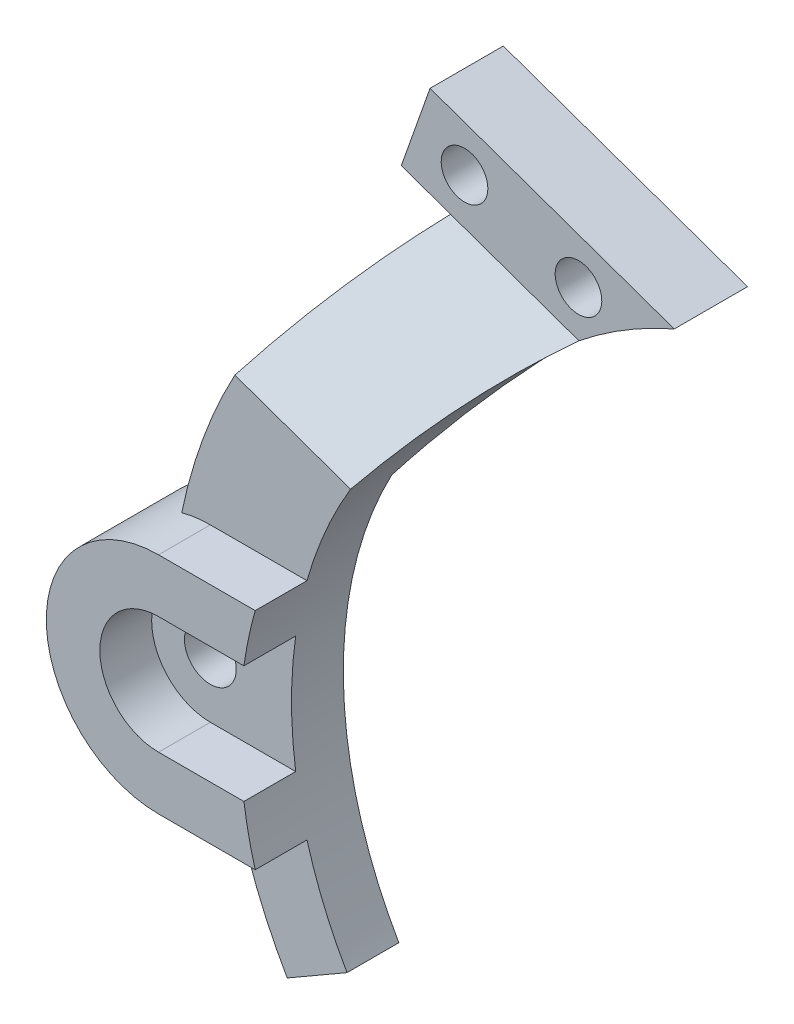
ISO-10303-21;
HEADER;
FILE_DESCRIPTION(('STEP AP214'),'2;1');
FILE_NAME('part.step','',(''),(''),'','','');
FILE_SCHEMA(('AUTOMOTIVE_DESIGN { 1 0 10303 214 1 1 1 1 }'));
ENDSEC;
DATA;
#1=APPLICATION_CONTEXT('core data for automotive mechanical design processes');
#2=APPLICATION_PROTOCOL_DEFINITION('international standard','automotive_design',2000,#1);
#3=PRODUCT_CONTEXT('',#1,'mechanical');
#4=PRODUCT('Part','Part','',(#3));
#5=PRODUCT_RELATED_PRODUCT_CATEGORY('part','',(#4));
#6=PRODUCT_DEFINITION_FORMATION('','',#4);
#7=PRODUCT_DEFINITION_CONTEXT('part definition',#1,'design');
#8=PRODUCT_DEFINITION('design','',#6,#7);
#9=PRODUCT_DEFINITION_SHAPE('','',#8);
#10=(LENGTH_UNIT() NAMED_UNIT(*) SI_UNIT(.MILLI.,.METRE.));
#11=(NAMED_UNIT(*) PLANE_ANGLE_UNIT() SI_UNIT($,.RADIAN.));
#12=(NAMED_UNIT(*) SI_UNIT($,.STERADIAN.) SOLID_ANGLE_UNIT());
#13=UNCERTAINTY_MEASURE_WITH_UNIT(LENGTH_MEASURE(1.E-05),#10,'distance_accuracy_value','');
#14=(GEOMETRIC_REPRESENTATION_CONTEXT(3) GLOBAL_UNCERTAINTY_ASSIGNED_CONTEXT((#13)) GLOBAL_UNIT_ASSIGNED_CONTEXT((#10,
#11,#12)) REPRESENTATION_CONTEXT('',''));
#15=CARTESIAN_POINT('',(0.,0.,0.));
#16=DIRECTION('',(0.,0.,1.));
#17=DIRECTION('',(1.,0.,0.));
#18=AXIS2_PLACEMENT_3D('',#15,#16,#17);
#19=CARTESIAN_POINT('',(0.,0.,15.));
#20=DIRECTION('',(0.,0.,-1.));
#21=DIRECTION('',(-1.,0.,0.));
#22=AXIS2_PLACEMENT_3D('',#19,#20,#21);
#23=CYLINDRICAL_SURFACE('',#22,6.5);
#24=DIRECTION('',(0.,0.,-1.));
#25=VECTOR('',#24,1.);
#26=CARTESIAN_POINT('',(-1.65609756097561,6.28548652600024,12.));
#27=LINE('',#26,#25);
#28=CARTESIAN_POINT('',(-1.65609756097561,6.28548652600024,12.));
#29=VERTEX_POINT('',#28);
#30=CARTESIAN_POINT('',(-1.65609756097561,6.28548652600024,9.));
#31=VERTEX_POINT('',#30);
#32=EDGE_CURVE('E214',#29,#31,#27,.T.);
#33=ORIENTED_EDGE('',*,*,#32,.T.);
#34=CARTESIAN_POINT('',(0.,0.,9.));
#35=DIRECTION('',(0.,0.,1.));
#36=DIRECTION('',(1.,0.,0.));
#37=AXIS2_PLACEMENT_3D('',#34,#35,#36);
#38=CIRCLE('',#37,6.5);
#39=CARTESIAN_POINT('',(0.,-6.5,9.));
#40=VERTEX_POINT('',#39);
#41=EDGE_CURVE('E389',#31,#40,#38,.T.);
#42=ORIENTED_EDGE('',*,*,#41,.T.);
#43=DIRECTION('',(0.,0.,-1.));
#44=VECTOR('',#43,1.);
#45=CARTESIAN_POINT('',(0.,-6.5,15.));
#46=LINE('',#45,#44);
#47=CARTESIAN_POINT('',(0.,-6.5,15.));
#48=VERTEX_POINT('',#47);
#49=EDGE_CURVE('E269',#48,#40,#46,.T.);
#50=ORIENTED_EDGE('',*,*,#49,.F.);
#51=CARTESIAN_POINT('',(0.,0.,15.));
#52=DIRECTION('',(0.,0.,1.));
#53=DIRECTION('',(1.,0.,0.));
#54=AXIS2_PLACEMENT_3D('',#51,#52,#53);
#55=CIRCLE('',#54,6.5);
#56=CARTESIAN_POINT('',(0.,6.5,15.));
#57=VERTEX_POINT('',#56);
#58=EDGE_CURVE('E236',#57,#48,#55,.T.);
#59=ORIENTED_EDGE('',*,*,#58,.F.);
#60=DIRECTION('',(0.,0.,-1.));
#61=VECTOR('',#60,1.);
#62=CARTESIAN_POINT('',(0.,6.5,15.));
#63=LINE('',#62,#61);
#64=CARTESIAN_POINT('',(0.,6.5,12.));
#65=VERTEX_POINT('',#64);
#66=EDGE_CURVE('E272',#57,#65,#63,.T.);
#67=ORIENTED_EDGE('',*,*,#66,.T.);
#68=CARTESIAN_POINT('',(0.,0.,12.));
#69=DIRECTION('',(0.,0.,1.));
#70=DIRECTION('',(1.,0.,0.));
#71=AXIS2_PLACEMENT_3D('',#68,#69,#70);
#72=CIRCLE('',#71,6.5);
#73=EDGE_CURVE('E190',#65,#29,#72,.T.);
#74=ORIENTED_EDGE('',*,*,#73,.T.);
#75=EDGE_LOOP('',(#33,#42,#50,#59,#67,#74));
#76=FACE_BOUND('',#75,.T.);
#77=ADVANCED_FACE('F35',(#76),#23,.T.);
#78=CARTESIAN_POINT('',(0.,6.5,15.));
#79=DIRECTION('',(0.,1.,0.));
#80=DIRECTION('',(-1.,0.,0.));
#81=AXIS2_PLACEMENT_3D('',#78,#79,#80);
#82=PLANE('',#81);
#83=DIRECTION('',(1.,0.,0.));
#84=VECTOR('',#83,1.);
#85=CARTESIAN_POINT('',(0.,6.5,12.));
#86=LINE('',#85,#84);
#87=CARTESIAN_POINT('',(5.59696989570416,6.5,12.));
#88=VERTEX_POINT('',#87);
#89=EDGE_CURVE('E184',#65,#88,#86,.T.);
#90=ORIENTED_EDGE('',*,*,#89,.F.);
#91=ORIENTED_EDGE('',*,*,#66,.F.);
#92=DIRECTION('',(1.,0.,0.));
#93=VECTOR('',#92,1.);
#94=CARTESIAN_POINT('',(0.,6.5,15.));
#95=LINE('',#94,#93);
#96=CARTESIAN_POINT('',(5.59696989570416,6.5,15.));
#97=VERTEX_POINT('',#96);
#98=EDGE_CURVE('E233',#57,#97,#95,.T.);
#99=ORIENTED_EDGE('',*,*,#98,.T.);
#100=DIRECTION('',(0.,0.,-1.));
#101=VECTOR('',#100,1.);
#102=CARTESIAN_POINT('',(5.59696989570416,6.5,15.));
#103=LINE('',#102,#101);
#104=EDGE_CURVE('E253',#97,#88,#103,.T.);
#105=ORIENTED_EDGE('',*,*,#104,.T.);
#106=EDGE_LOOP('',(#90,#91,#99,#105));
#107=FACE_BOUND('',#106,.T.);
#108=ADVANCED_FACE('F37',(#107),#82,.T.);
#109=CARTESIAN_POINT('',(0.,-6.5,15.));
#110=DIRECTION('',(0.,1.,0.));
#111=DIRECTION('',(-1.,0.,0.));
#112=AXIS2_PLACEMENT_3D('',#109,#110,#111);
#113=PLANE('',#112);
#114=ORIENTED_EDGE('',*,*,#49,.T.);
#115=DIRECTION('',(1.,0.,0.));
#116=VECTOR('',#115,1.);
#117=CARTESIAN_POINT('',(0.,-6.5,9.));
#118=LINE('',#117,#116);
#119=CARTESIAN_POINT('',(1.46491233720735,-6.5,9.));
#120=VERTEX_POINT('',#119);
#121=EDGE_CURVE('E384',#40,#120,#118,.T.);
#122=ORIENTED_EDGE('',*,*,#121,.T.);
#123=DIRECTION('',(0.,0.,-1.));
#124=VECTOR('',#123,1.);
#125=CARTESIAN_POINT('',(1.46491233720735,-6.5,12.));
#126=LINE('',#125,#124);
#127=CARTESIAN_POINT('',(1.46491233720735,-6.5,12.));
#128=VERTEX_POINT('',#127);
#129=EDGE_CURVE('E331',#128,#120,#126,.T.);
#130=ORIENTED_EDGE('',*,*,#129,.F.);
#131=DIRECTION('',(1.,0.,0.));
#132=VECTOR('',#131,1.);
#133=CARTESIAN_POINT('',(0.,-6.5,12.));
#134=LINE('',#133,#132);
#135=CARTESIAN_POINT('',(5.59696989570416,-6.5,12.));
#136=VERTEX_POINT('',#135);
#137=EDGE_CURVE('E329',#128,#136,#134,.T.);
#138=ORIENTED_EDGE('',*,*,#137,.T.);
#139=DIRECTION('',(0.,0.,-1.));
#140=VECTOR('',#139,1.);
#141=CARTESIAN_POINT('',(5.59696989570416,-6.5,15.));
#142=LINE('',#141,#140);
#143=CARTESIAN_POINT('',(5.59696989570416,-6.5,15.));
#144=VERTEX_POINT('',#143);
#145=EDGE_CURVE('E266',#144,#136,#142,.T.);
#146=ORIENTED_EDGE('',*,*,#145,.F.);
#147=DIRECTION('',(1.,0.,0.));
#148=VECTOR('',#147,1.);
#149=CARTESIAN_POINT('',(0.,-6.5,15.));
#150=LINE('',#149,#148);
#151=EDGE_CURVE('E238',#48,#144,#150,.T.);
#152=ORIENTED_EDGE('',*,*,#151,.F.);
#153=EDGE_LOOP('',(#114,#122,#130,#138,#146,#152));
#154=FACE_BOUND('',#153,.T.);
#155=ADVANCED_FACE('F368',(#154),#113,.F.);
#156=CARTESIAN_POINT('',(0.,-3.4,15.));
#157=DIRECTION('',(0.,-1.,0.));
#158=DIRECTION('',(1.,0.,0.));
#159=AXIS2_PLACEMENT_3D('',#156,#157,#158);
#160=PLANE('',#159);
#161=DIRECTION('',(0.,0.,-1.));
#162=VECTOR('',#161,1.);
#163=CARTESIAN_POINT('',(4.94205396083239,-3.4,15.));
#164=LINE('',#163,#162);
#165=CARTESIAN_POINT('',(4.94205396083239,-3.4,15.));
#166=VERTEX_POINT('',#165);
#167=CARTESIAN_POINT('',(4.94205396083239,-3.4,12.));
#168=VERTEX_POINT('',#167);
#169=EDGE_CURVE('E264',#166,#168,#164,.T.);
#170=ORIENTED_EDGE('',*,*,#169,.T.);
#171=DIRECTION('',(-1.,0.,0.));
#172=VECTOR('',#171,1.);
#173=CARTESIAN_POINT('',(0.,-3.4,12.));
#174=LINE('',#173,#172);
#175=CARTESIAN_POINT('',(0.,-3.4,12.));
#176=VERTEX_POINT('',#175);
#177=EDGE_CURVE('E227',#168,#176,#174,.T.);
#178=ORIENTED_EDGE('',*,*,#177,.T.);
#179=DIRECTION('',(0.,0.,-1.));
#180=VECTOR('',#179,1.);
#181=CARTESIAN_POINT('',(0.,-3.4,15.));
#182=LINE('',#181,#180);
#183=CARTESIAN_POINT('',(0.,-3.4,15.));
#184=VERTEX_POINT('',#183);
#185=EDGE_CURVE('E261',#184,#176,#182,.T.);
#186=ORIENTED_EDGE('',*,*,#185,.F.);
#187=DIRECTION('',(-1.,0.,0.));
#188=VECTOR('',#187,1.);
#189=CARTESIAN_POINT('',(0.,-3.4,15.));
#190=LINE('',#189,#188);
#191=EDGE_CURVE('E243',#166,#184,#190,.T.);
#192=ORIENTED_EDGE('',*,*,#191,.F.);
#193=EDGE_LOOP('',(#170,#178,#186,#192));
#194=FACE_BOUND('',#193,.T.);
#195=ADVANCED_FACE('F363',(#194),#160,.F.);
#196=CARTESIAN_POINT('',(0.,0.,15.));
#197=DIRECTION('',(0.,0.,-1.));
#198=DIRECTION('',(-1.,0.,0.));
#199=AXIS2_PLACEMENT_3D('',#196,#197,#198);
#200=CYLINDRICAL_SURFACE('',#199,3.4);
#201=CARTESIAN_POINT('',(0.,0.,12.));
#202=DIRECTION('',(0.,0.,1.));
#203=DIRECTION('',(1.,0.,0.));
#204=AXIS2_PLACEMENT_3D('',#201,#202,#203);
#205=CIRCLE('',#204,3.4);
#206=CARTESIAN_POINT('',(0.,3.4,12.));
#207=VERTEX_POINT('',#206);
#208=EDGE_CURVE('E224',#207,#176,#205,.T.);
#209=ORIENTED_EDGE('',*,*,#208,.F.);
#210=DIRECTION('',(0.,0.,-1.));
#211=VECTOR('',#210,1.);
#212=CARTESIAN_POINT('',(0.,3.4,15.));
#213=LINE('',#212,#211);
#214=CARTESIAN_POINT('',(0.,3.4,15.));
#215=VERTEX_POINT('',#214);
#216=EDGE_CURVE('E258',#215,#207,#213,.T.);
#217=ORIENTED_EDGE('',*,*,#216,.F.);
#218=CARTESIAN_POINT('',(0.,0.,15.));
#219=DIRECTION('',(0.,0.,1.));
#220=DIRECTION('',(1.,0.,0.));
#221=AXIS2_PLACEMENT_3D('',#218,#219,#220);
#222=CIRCLE('',#221,3.4);
#223=EDGE_CURVE('E246',#215,#184,#222,.T.);
#224=ORIENTED_EDGE('',*,*,#223,.T.);
#225=ORIENTED_EDGE('',*,*,#185,.T.);
#226=EDGE_LOOP('',(#209,#217,#224,#225));
#227=FACE_BOUND('',#226,.T.);
#228=ADVANCED_FACE('F438',(#227),#200,.F.);
#229=CARTESIAN_POINT('',(0.,3.4,15.));
#230=DIRECTION('',(0.,1.,0.));
#231=DIRECTION('',(-1.,0.,0.));
#232=AXIS2_PLACEMENT_3D('',#229,#230,#231);
#233=PLANE('',#232);
#234=ORIENTED_EDGE('',*,*,#216,.T.);
#235=DIRECTION('',(1.,0.,0.));
#236=VECTOR('',#235,1.);
#237=CARTESIAN_POINT('',(0.,3.4,12.));
#238=LINE('',#237,#236);
#239=CARTESIAN_POINT('',(4.94205396083239,3.4,12.));
#240=VERTEX_POINT('',#239);
#241=EDGE_CURVE('E222',#207,#240,#238,.T.);
#242=ORIENTED_EDGE('',*,*,#241,.T.);
#243=DIRECTION('',(0.,0.,-1.));
#244=VECTOR('',#243,1.);
#245=CARTESIAN_POINT('',(4.94205396083239,3.4,15.));
#246=LINE('',#245,#244);
#247=CARTESIAN_POINT('',(4.94205396083239,3.4,15.));
#248=VERTEX_POINT('',#247);
#249=EDGE_CURVE('E255',#248,#240,#246,.T.);
#250=ORIENTED_EDGE('',*,*,#249,.F.);
#251=DIRECTION('',(1.,0.,0.));
#252=VECTOR('',#251,1.);
#253=CARTESIAN_POINT('',(0.,3.4,15.));
#254=LINE('',#253,#252);
#255=EDGE_CURVE('E249',#215,#248,#254,.T.);
#256=ORIENTED_EDGE('',*,*,#255,.F.);
#257=EDGE_LOOP('',(#234,#242,#250,#256));
#258=FACE_BOUND('',#257,.T.);
#259=ADVANCED_FACE('F353',(#258),#233,.F.);
#260=CARTESIAN_POINT('',(28.7,0.,15.));
#261=DIRECTION('',(0.,0.,-1.));
#262=DIRECTION('',(-1.,0.,0.));
#263=AXIS2_PLACEMENT_3D('',#260,#261,#262);
#264=CYLINDRICAL_SURFACE('',#263,24.);
#265=CARTESIAN_POINT('',(28.7,0.,16.7872185863829));
#266=DIRECTION('',(-0.235702260395517,-0.666666666666668,-0.707106781186546));
#267=DIRECTION('',(0.235702260395516,0.666666666666665,-0.707106781186549));
#268=AXIS2_PLACEMENT_3D('',#265,#266,#267);
#269=ELLIPSE('',#268,33.9411254969544,24.);
#270=CARTESIAN_POINT('',(8.12303281874317,12.3526686032403,12.));
#271=VERTEX_POINT('',#270);
#272=CARTESIAN_POINT('',(13.5911468945325,18.647320392952,4.2426406871193));
#273=VERTEX_POINT('',#272);
#274=EDGE_CURVE('E167',#271,#273,#269,.T.);
#275=ORIENTED_EDGE('',*,*,#274,.F.);
#276=CARTESIAN_POINT('',(28.7,0.,12.));
#277=DIRECTION('',(0.,0.,1.));
#278=DIRECTION('',(1.,0.,0.));
#279=AXIS2_PLACEMENT_3D('',#276,#277,#278);
#280=CIRCLE('',#279,24.);
#281=EDGE_CURVE('E176',#271,#88,#280,.T.);
#282=ORIENTED_EDGE('',*,*,#281,.T.);
#283=ORIENTED_EDGE('',*,*,#104,.F.);
#284=CARTESIAN_POINT('',(28.7,0.,15.));
#285=DIRECTION('',(0.,0.,1.));
#286=DIRECTION('',(1.,0.,0.));
#287=AXIS2_PLACEMENT_3D('',#284,#285,#286);
#288=CIRCLE('',#287,24.);
#289=EDGE_CURVE('E244',#97,#248,#288,.T.);
#290=ORIENTED_EDGE('',*,*,#289,.T.);
#291=ORIENTED_EDGE('',*,*,#249,.T.);
#292=CARTESIAN_POINT('',(28.7,0.,12.));
#293=DIRECTION('',(0.,0.,1.));
#294=DIRECTION('',(1.,0.,0.));
#295=AXIS2_PLACEMENT_3D('',#292,#293,#294);
#296=CIRCLE('',#295,24.);
#297=EDGE_CURVE('E219',#240,#168,#296,.T.);
#298=ORIENTED_EDGE('',*,*,#297,.T.);
#299=ORIENTED_EDGE('',*,*,#169,.F.);
#300=EDGE_CURVE('E240',#166,#144,#288,.T.);
#301=ORIENTED_EDGE('',*,*,#300,.T.);
#302=ORIENTED_EDGE('',*,*,#145,.T.);
#303=CARTESIAN_POINT('',(28.7,0.,12.));
#304=DIRECTION('',(0.,0.,1.));
#305=DIRECTION('',(1.,0.,0.));
#306=AXIS2_PLACEMENT_3D('',#303,#304,#305);
#307=CIRCLE('',#306,24.);
#308=CARTESIAN_POINT('',(7.91539030917349,-12.,12.));
#309=VERTEX_POINT('',#308);
#310=EDGE_CURVE('E326',#136,#309,#307,.T.);
#311=ORIENTED_EDGE('',*,*,#310,.T.);
#312=DIRECTION('',(0.,0.,-1.));
#313=VECTOR('',#312,1.);
#314=CARTESIAN_POINT('',(7.91539030917349,-12.,12.));
#315=LINE('',#314,#313);
#316=CARTESIAN_POINT('',(7.91539030917349,-12.,9.));
#317=VERTEX_POINT('',#316);
#318=EDGE_CURVE('E334',#309,#317,#315,.T.);
#319=ORIENTED_EDGE('',*,*,#318,.T.);
#320=CARTESIAN_POINT('',(28.7,0.,9.));
#321=DIRECTION('',(0.,0.,1.));
#322=DIRECTION('',(1.,0.,0.));
#323=AXIS2_PLACEMENT_3D('',#320,#321,#322);
#324=CIRCLE('',#323,24.);
#325=CARTESIAN_POINT('',(7.50225048383733,11.2541288179061,9.));
#326=VERTEX_POINT('',#325);
#327=EDGE_CURVE('E58',#326,#317,#324,.T.);
#328=ORIENTED_EDGE('',*,*,#327,.F.);
#329=CARTESIAN_POINT('',(28.7,0.,12.5445778992636));
#330=DIRECTION('',(0.235702260395517,0.666666666666668,0.707106781186546));
#331=DIRECTION('',(0.235702260395516,0.666666666666665,-0.707106781186549));
#332=AXIS2_PLACEMENT_3D('',#329,#330,#331);
#333=ELLIPSE('',#332,33.9411254969543,24.);
#334=CARTESIAN_POINT('',(13.5911468945325,18.647320392952,0.));
#335=VERTEX_POINT('',#334);
#336=EDGE_CURVE('E313',#335,#326,#333,.T.);
#337=ORIENTED_EDGE('',*,*,#336,.F.);
#338=CARTESIAN_POINT('',(28.7,0.,0.));
#339=DIRECTION('',(0.,0.,1.));
#340=DIRECTION('',(1.,0.,0.));
#341=AXIS2_PLACEMENT_3D('',#338,#339,#340);
#342=CIRCLE('',#341,24.);
#343=CARTESIAN_POINT('',(19.1083369533746,22.,0.));
#344=VERTEX_POINT('',#343);
#345=EDGE_CURVE('E232',#344,#335,#342,.T.);
#346=ORIENTED_EDGE('',*,*,#345,.F.);
#347=DIRECTION('',(0.,0.,-1.));
#348=VECTOR('',#347,1.);
#349=CARTESIAN_POINT('',(19.1083369533746,22.,12.));
#350=LINE('',#349,#348);
#351=CARTESIAN_POINT('',(19.1083369533746,22.,4.2426406871193));
#352=VERTEX_POINT('',#351);
#353=EDGE_CURVE('E212',#352,#344,#350,.T.);
#354=ORIENTED_EDGE('',*,*,#353,.F.);
#355=CARTESIAN_POINT('',(28.7,0.,4.2426406871193));
#356=DIRECTION('',(0.,0.,-1.));
#357=DIRECTION('',(0.,1.,0.));
#358=AXIS2_PLACEMENT_3D('',#355,#356,#357);
#359=CIRCLE('',#358,24.);
#360=EDGE_CURVE('E179',#273,#352,#359,.T.);
#361=ORIENTED_EDGE('',*,*,#360,.F.);
#362=EDGE_LOOP('',(#275,#282,#283,#290,#291,#298,#299,#301,#302,#311,#319,#328,#337,#346,#354,#361));
#363=FACE_BOUND('',#362,.T.);
#364=ADVANCED_FACE('F175',(#363),#264,.F.);
#365=CARTESIAN_POINT('',(0.,0.,15.));
#366=DIRECTION('',(0.,0.,1.));
#367=DIRECTION('',(1.,0.,0.));
#368=AXIS2_PLACEMENT_3D('',#365,#366,#367);
#369=PLANE('',#368);
#370=ORIENTED_EDGE('',*,*,#98,.F.);
#371=ORIENTED_EDGE('',*,*,#58,.T.);
#372=ORIENTED_EDGE('',*,*,#151,.T.);
#373=ORIENTED_EDGE('',*,*,#300,.F.);
#374=ORIENTED_EDGE('',*,*,#191,.T.);
#375=ORIENTED_EDGE('',*,*,#223,.F.);
#376=ORIENTED_EDGE('',*,*,#255,.T.);
#377=ORIENTED_EDGE('',*,*,#289,.F.);
#378=EDGE_LOOP('',(#370,#371,#372,#373,#374,#375,#376,#377));
#379=FACE_BOUND('',#378,.T.);
#380=ADVANCED_FACE('F349',(#379),#369,.T.);
#381=CARTESIAN_POINT('',(0.,0.,0.));
#382=DIRECTION('',(0.,0.,1.));
#383=DIRECTION('',(1.,0.,0.));
#384=AXIS2_PLACEMENT_3D('',#381,#382,#383);
#385=PLANE('',#384);
#386=ORIENTED_EDGE('',*,*,#345,.T.);
#387=DIRECTION('',(-0.942809041582063,0.333333333333334,0.));
#388=VECTOR('',#387,1.);
#389=CARTESIAN_POINT('',(28.7553787856927,13.2859547920897,0.));
#390=LINE('',#389,#388);
#391=CARTESIAN_POINT('',(6.15436848644617,21.2766186142218,0.));
#392=VERTEX_POINT('',#391);
#393=EDGE_CURVE('E289',#335,#392,#390,.T.);
#394=ORIENTED_EDGE('',*,*,#393,.T.);
#395=DIRECTION('',(0.942809041582064,-0.333333333333333,0.));
#396=VECTOR('',#395,1.);
#397=CARTESIAN_POINT('',(7.37041485531007,20.8466812973913,0.));
#398=LINE('',#397,#396);
#399=CARTESIAN_POINT('',(3.29953466297694,22.2859547920897,0.));
#400=VERTEX_POINT('',#399);
#401=EDGE_CURVE('E201',#400,#392,#398,.T.);
#402=ORIENTED_EDGE('',*,*,#401,.F.);
#403=DIRECTION('',(-0.333333333333334,-0.942809041582063,0.));
#404=VECTOR('',#403,1.);
#405=CARTESIAN_POINT('',(-4.07088019233316,1.43927349469839,0.));
#406=LINE('',#405,#404);
#407=CARTESIAN_POINT('',(4.96620132964361,27.,0.));
#408=VERTEX_POINT('',#407);
#409=EDGE_CURVE('E207',#408,#400,#406,.T.);
#410=ORIENTED_EDGE('',*,*,#409,.F.);
#411=DIRECTION('',(-0.942809041582063,0.333333333333334,0.));
#412=VECTOR('',#411,1.);
#413=CARTESIAN_POINT('',(9.03708152197676,25.5607265053016,0.));
#414=LINE('',#413,#412);
#415=EDGE_CURVE('E204',#344,#408,#414,.T.);
#416=ORIENTED_EDGE('',*,*,#415,.F.);
#417=EDGE_LOOP('',(#386,#394,#402,#410,#416));
#418=FACE_BOUND('',#417,.T.);
#419=CARTESIAN_POINT('',(6.96129512105646,23.6429773960448,0.));
#420=DIRECTION('',(0.,0.,1.));
#421=DIRECTION('',(1.,0.,0.));
#422=AXIS2_PLACEMENT_3D('',#419,#420,#421);
#423=CIRCLE('',#422,1.35);
#424=CARTESIAN_POINT('',(8.31129512105647,23.6429773960448,0.));
#425=VERTEX_POINT('',#424);
#426=EDGE_CURVE('E194',#425,#425,#423,.T.);
#427=ORIENTED_EDGE('',*,*,#426,.T.);
#428=EDGE_LOOP('',(#427));
#429=FACE_BOUND('',#428,.T.);
#430=CARTESIAN_POINT('',(13.5609584121309,21.3096440627115,0.));
#431=DIRECTION('',(0.,0.,1.));
#432=DIRECTION('',(1.,0.,0.));
#433=AXIS2_PLACEMENT_3D('',#430,#431,#432);
#434=CIRCLE('',#433,1.35);
#435=CARTESIAN_POINT('',(14.9109584121309,21.3096440627115,0.));
#436=VERTEX_POINT('',#435);
#437=EDGE_CURVE('E197',#436,#436,#434,.T.);
#438=ORIENTED_EDGE('',*,*,#437,.T.);
#439=EDGE_LOOP('',(#438));
#440=FACE_BOUND('',#439,.T.);
#441=ADVANCED_FACE('F294',(#418,#429,#440),#385,.F.);
#442=CARTESIAN_POINT('',(0.,0.,12.));
#443=DIRECTION('',(0.,0.,-1.));
#444=DIRECTION('',(-1.,0.,0.));
#445=AXIS2_PLACEMENT_3D('',#442,#443,#444);
#446=CYLINDRICAL_SURFACE('',#445,1.5);
#447=CARTESIAN_POINT('',(0.,0.,9.));
#448=DIRECTION('',(0.,0.,1.));
#449=DIRECTION('',(1.,0.,0.));
#450=AXIS2_PLACEMENT_3D('',#447,#448,#449);
#451=CIRCLE('',#450,1.5);
#452=CARTESIAN_POINT('',(1.5,0.,9.));
#453=VERTEX_POINT('',#452);
#454=EDGE_CURVE('E316',#453,#453,#451,.T.);
#455=ORIENTED_EDGE('',*,*,#454,.F.);
#456=EDGE_LOOP('',(#455));
#457=FACE_BOUND('',#456,.T.);
#458=CARTESIAN_POINT('',(0.,0.,12.));
#459=DIRECTION('',(0.,0.,1.));
#460=DIRECTION('',(1.,0.,0.));
#461=AXIS2_PLACEMENT_3D('',#458,#459,#460);
#462=CIRCLE('',#461,1.5);
#463=CARTESIAN_POINT('',(1.5,0.,12.));
#464=VERTEX_POINT('',#463);
#465=EDGE_CURVE('E229',#464,#464,#462,.T.);
#466=ORIENTED_EDGE('',*,*,#465,.T.);
#467=EDGE_LOOP('',(#466));
#468=FACE_BOUND('',#467,.T.);
#469=ADVANCED_FACE('F417',(#457,#468),#446,.F.);
#470=CARTESIAN_POINT('',(0.,0.,12.));
#471=DIRECTION('',(0.,0.,1.));
#472=DIRECTION('',(1.,0.,0.));
#473=AXIS2_PLACEMENT_3D('',#470,#471,#472);
#474=PLANE('',#473);
#475=ORIENTED_EDGE('',*,*,#297,.F.);
#476=ORIENTED_EDGE('',*,*,#241,.F.);
#477=ORIENTED_EDGE('',*,*,#208,.T.);
#478=ORIENTED_EDGE('',*,*,#177,.F.);
#479=EDGE_LOOP('',(#475,#476,#477,#478));
#480=FACE_BOUND('',#479,.T.);
#481=ORIENTED_EDGE('',*,*,#465,.F.);
#482=EDGE_LOOP('',(#481));
#483=FACE_BOUND('',#482,.T.);
#484=ADVANCED_FACE('F356',(#480,#483),#474,.T.);
#485=CARTESIAN_POINT('',(7.37041485531007,20.8466812973913,12.));
#486=DIRECTION('',(0.333333333333333,0.942809041582063,0.));
#487=DIRECTION('',(-0.942809041582064,0.333333333333333,0.));
#488=AXIS2_PLACEMENT_3D('',#485,#486,#487);
#489=PLANE('',#488);
#490=DIRECTION('',(0.,0.,-1.));
#491=VECTOR('',#490,1.);
#492=CARTESIAN_POINT('',(6.15436848644617,21.2766186142218,12.));
#493=LINE('',#492,#491);
#494=CARTESIAN_POINT('',(6.15436848644617,21.2766186142218,4.2426406871193));
#495=VERTEX_POINT('',#494);
#496=EDGE_CURVE('E217',#495,#392,#493,.T.);
#497=ORIENTED_EDGE('',*,*,#496,.F.);
#498=DIRECTION('',(-0.942809041582063,0.333333333333334,0.));
#499=VECTOR('',#498,1.);
#500=CARTESIAN_POINT('',(28.7553787856927,13.2859547920897,4.2426406871193));
#501=LINE('',#500,#499);
#502=CARTESIAN_POINT('',(3.29953466297694,22.2859547920897,4.2426406871193));
#503=VERTEX_POINT('',#502);
#504=EDGE_CURVE('E305',#495,#503,#501,.T.);
#505=ORIENTED_EDGE('',*,*,#504,.T.);
#506=DIRECTION('',(0.,0.,-1.));
#507=VECTOR('',#506,1.);
#508=CARTESIAN_POINT('',(3.29953466297694,22.2859547920897,12.));
#509=LINE('',#508,#507);
#510=EDGE_CURVE('E186',#503,#400,#509,.T.);
#511=ORIENTED_EDGE('',*,*,#510,.T.);
#512=ORIENTED_EDGE('',*,*,#401,.T.);
#513=EDGE_LOOP('',(#497,#505,#511,#512));
#514=FACE_BOUND('',#513,.T.);
#515=ADVANCED_FACE('F302',(#514),#489,.F.);
#516=CARTESIAN_POINT('',(28.7,0.,12.));
#517=DIRECTION('',(0.,0.,-1.));
#518=DIRECTION('',(-1.,0.,0.));
#519=AXIS2_PLACEMENT_3D('',#516,#517,#518);
#520=CYLINDRICAL_SURFACE('',#519,31.);
#521=CARTESIAN_POINT('',(28.7,0.,12.));
#522=DIRECTION('',(0.,0.,1.));
#523=DIRECTION('',(1.,0.,0.));
#524=AXIS2_PLACEMENT_3D('',#521,#522,#523);
#525=CIRCLE('',#524,31.);
#526=CARTESIAN_POINT('',(1.41925869971527,14.7228106727941,12.));
#527=VERTEX_POINT('',#526);
#528=EDGE_CURVE('E209',#527,#29,#525,.T.);
#529=ORIENTED_EDGE('',*,*,#528,.F.);
#530=CARTESIAN_POINT('',(28.7,0.,16.7872185863829));
#531=DIRECTION('',(-0.235702260395517,-0.666666666666668,-0.707106781186546));
#532=DIRECTION('',(0.235702260395516,0.666666666666665,-0.707106781186549));
#533=AXIS2_PLACEMENT_3D('',#530,#531,#532);
#534=ELLIPSE('',#533,43.840620433566,31.);
#535=EDGE_CURVE('E50',#527,#495,#534,.T.);
#536=ORIENTED_EDGE('',*,*,#535,.T.);
#537=ORIENTED_EDGE('',*,*,#496,.T.);
#538=CARTESIAN_POINT('',(28.7,0.,12.5445778992636));
#539=DIRECTION('',(0.235702260395517,0.666666666666668,0.707106781186546));
#540=DIRECTION('',(0.235702260395516,0.666666666666665,-0.707106781186549));
#541=AXIS2_PLACEMENT_3D('',#538,#539,#540);
#542=ELLIPSE('',#541,43.840620433566,31.);
#543=CARTESIAN_POINT('',(0.846130440484212,13.6074226274295,9.));
#544=VERTEX_POINT('',#543);
#545=EDGE_CURVE('E172',#392,#544,#542,.T.);
#546=ORIENTED_EDGE('',*,*,#545,.T.);
#547=CARTESIAN_POINT('',(28.7,0.,9.));
#548=DIRECTION('',(0.,0.,1.));
#549=DIRECTION('',(1.,0.,0.));
#550=AXIS2_PLACEMENT_3D('',#547,#548,#549);
#551=CIRCLE('',#550,31.);
#552=EDGE_CURVE('E283',#544,#31,#551,.T.);
#553=ORIENTED_EDGE('',*,*,#552,.T.);
#554=ORIENTED_EDGE('',*,*,#32,.F.);
#555=EDGE_LOOP('',(#529,#536,#537,#546,#553,#554));
#556=FACE_BOUND('',#555,.T.);
#557=ADVANCED_FACE('F281',(#556),#520,.T.);
#558=CARTESIAN_POINT('',(9.03708152197676,25.5607265053016,12.));
#559=DIRECTION('',(-0.333333333333334,-0.942809041582063,0.));
#560=DIRECTION('',(0.942809041582063,-0.333333333333334,0.));
#561=AXIS2_PLACEMENT_3D('',#558,#559,#560);
#562=PLANE('',#561);
#563=DIRECTION('',(0.,0.,-1.));
#564=VECTOR('',#563,1.);
#565=CARTESIAN_POINT('',(4.96620132964361,27.,12.));
#566=LINE('',#565,#564);
#567=CARTESIAN_POINT('',(4.96620132964361,27.,4.2426406871193));
#568=VERTEX_POINT('',#567);
#569=EDGE_CURVE('E188',#568,#408,#566,.T.);
#570=ORIENTED_EDGE('',*,*,#569,.F.);
#571=DIRECTION('',(-0.942809041582063,0.333333333333334,0.));
#572=VECTOR('',#571,1.);
#573=CARTESIAN_POINT('',(30.4220454523593,18.,4.2426406871193));
#574=LINE('',#573,#572);
#575=EDGE_CURVE('E312',#352,#568,#574,.T.);
#576=ORIENTED_EDGE('',*,*,#575,.F.);
#577=ORIENTED_EDGE('',*,*,#353,.T.);
#578=ORIENTED_EDGE('',*,*,#415,.T.);
#579=EDGE_LOOP('',(#570,#576,#577,#578));
#580=FACE_BOUND('',#579,.T.);
#581=ADVANCED_FACE('F310',(#580),#562,.F.);
#582=CARTESIAN_POINT('',(13.5609584121309,21.3096440627115,12.));
#583=DIRECTION('',(0.,0.,-1.));
#584=DIRECTION('',(-1.,0.,0.));
#585=AXIS2_PLACEMENT_3D('',#582,#583,#584);
#586=CYLINDRICAL_SURFACE('',#585,1.35);
#587=CARTESIAN_POINT('',(13.5609584121309,21.3096440627115,4.2426406871193));
#588=DIRECTION('',(0.,0.,-1.));
#589=DIRECTION('',(0.,1.,0.));
#590=AXIS2_PLACEMENT_3D('',#587,#588,#589);
#591=CIRCLE('',#590,1.35);
#592=CARTESIAN_POINT('',(13.5609584121309,22.6596440627115,4.2426406871193));
#593=VERTEX_POINT('',#592);
#594=EDGE_CURVE('E390',#593,#593,#591,.T.);
#595=ORIENTED_EDGE('',*,*,#594,.F.);
#596=EDGE_LOOP('',(#595));
#597=FACE_BOUND('',#596,.T.);
#598=ORIENTED_EDGE('',*,*,#437,.F.);
#599=EDGE_LOOP('',(#598));
#600=FACE_BOUND('',#599,.T.);
#601=ADVANCED_FACE('F412',(#597,#600),#586,.F.);
#602=CARTESIAN_POINT('',(6.96129512105646,23.6429773960448,12.));
#603=DIRECTION('',(0.,0.,-1.));
#604=DIRECTION('',(-1.,0.,0.));
#605=AXIS2_PLACEMENT_3D('',#602,#603,#604);
#606=CYLINDRICAL_SURFACE('',#605,1.35);
#607=CARTESIAN_POINT('',(6.96129512105646,23.6429773960448,4.2426406871193));
#608=DIRECTION('',(0.,0.,-1.));
#609=DIRECTION('',(0.,1.,0.));
#610=AXIS2_PLACEMENT_3D('',#607,#608,#609);
#611=CIRCLE('',#610,1.35);
#612=CARTESIAN_POINT('',(6.96129512105646,24.9929773960449,4.2426406871193));
#613=VERTEX_POINT('',#612);
#614=EDGE_CURVE('E180',#613,#613,#611,.T.);
#615=ORIENTED_EDGE('',*,*,#614,.F.);
#616=EDGE_LOOP('',(#615));
#617=FACE_BOUND('',#616,.T.);
#618=ORIENTED_EDGE('',*,*,#426,.F.);
#619=EDGE_LOOP('',(#618));
#620=FACE_BOUND('',#619,.T.);
#621=ADVANCED_FACE('F409',(#617,#620),#606,.F.);
#622=CARTESIAN_POINT('',(-4.07088019233316,1.43927349469839,12.));
#623=DIRECTION('',(0.942809041582063,-0.333333333333334,0.));
#624=DIRECTION('',(0.333333333333334,0.942809041582063,0.));
#625=AXIS2_PLACEMENT_3D('',#622,#623,#624);
#626=PLANE('',#625);
#627=ORIENTED_EDGE('',*,*,#510,.F.);
#628=DIRECTION('',(0.333333333333334,0.942809041582063,0.));
#629=VECTOR('',#628,1.);
#630=CARTESIAN_POINT('',(-4.07088019233316,1.43927349469839,4.2426406871193));
#631=LINE('',#630,#629);
#632=EDGE_CURVE('E11',#503,#568,#631,.T.);
#633=ORIENTED_EDGE('',*,*,#632,.T.);
#634=ORIENTED_EDGE('',*,*,#569,.T.);
#635=ORIENTED_EDGE('',*,*,#409,.T.);
#636=EDGE_LOOP('',(#627,#633,#634,#635));
#637=FACE_BOUND('',#636,.T.);
#638=ADVANCED_FACE('F307',(#637),#626,.F.);
#639=CARTESIAN_POINT('',(0.,0.,12.));
#640=DIRECTION('',(0.,0.,1.));
#641=DIRECTION('',(1.,0.,0.));
#642=AXIS2_PLACEMENT_3D('',#639,#640,#641);
#643=PLANE('',#642);
#644=DIRECTION('',(0.942809041582063,-0.333333333333334,0.));
#645=VECTOR('',#644,1.);
#646=CARTESIAN_POINT('',(4.7846284176832,13.5329727984066,12.));
#647=LINE('',#646,#645);
#648=EDGE_CURVE('E43',#527,#271,#647,.T.);
#649=ORIENTED_EDGE('',*,*,#648,.F.);
#650=ORIENTED_EDGE('',*,*,#528,.T.);
#651=ORIENTED_EDGE('',*,*,#73,.F.);
#652=ORIENTED_EDGE('',*,*,#89,.T.);
#653=ORIENTED_EDGE('',*,*,#281,.F.);
#654=EDGE_LOOP('',(#649,#650,#651,#652,#653));
#655=FACE_BOUND('',#654,.T.);
#656=ADVANCED_FACE('F182',(#655),#643,.T.);
#657=CARTESIAN_POINT('',(28.7,0.,12.));
#658=DIRECTION('',(0.,0.,-1.));
#659=DIRECTION('',(-1.,0.,0.));
#660=AXIS2_PLACEMENT_3D('',#657,#658,#659);
#661=CYLINDRICAL_SURFACE('',#660,28.);
#662=CARTESIAN_POINT('',(28.7,0.,9.));
#663=DIRECTION('',(0.,0.,1.));
#664=DIRECTION('',(1.,0.,0.));
#665=AXIS2_PLACEMENT_3D('',#662,#663,#664);
#666=CIRCLE('',#665,28.);
#667=CARTESIAN_POINT('',(4.45128869403573,-14.,9.));
#668=VERTEX_POINT('',#667);
#669=EDGE_CURVE('E299',#668,#120,#666,.F.);
#670=ORIENTED_EDGE('',*,*,#669,.F.);
#671=DIRECTION('',(0.,0.,-1.));
#672=VECTOR('',#671,1.);
#673=CARTESIAN_POINT('',(4.45128869403573,-14.,12.));
#674=LINE('',#673,#672);
#675=CARTESIAN_POINT('',(4.45128869403573,-14.,12.));
#676=VERTEX_POINT('',#675);
#677=EDGE_CURVE('E198',#676,#668,#674,.T.);
#678=ORIENTED_EDGE('',*,*,#677,.F.);
#679=CARTESIAN_POINT('',(28.7,0.,12.));
#680=DIRECTION('',(0.,0.,1.));
#681=DIRECTION('',(1.,0.,0.));
#682=AXIS2_PLACEMENT_3D('',#679,#680,#681);
#683=CIRCLE('',#682,28.);
#684=EDGE_CURVE('E315',#676,#128,#683,.F.);
#685=ORIENTED_EDGE('',*,*,#684,.T.);
#686=ORIENTED_EDGE('',*,*,#129,.T.);
#687=EDGE_LOOP('',(#670,#678,#685,#686));
#688=FACE_BOUND('',#687,.T.);
#689=ADVANCED_FACE('F382',(#688),#661,.T.);
#690=CARTESIAN_POINT('',(7.17500000000004,-12.4274645443067,12.));
#691=DIRECTION('',(-0.500000000000001,0.866025403784438,0.));
#692=DIRECTION('',(-0.866025403784438,-0.500000000000002,0.));
#693=AXIS2_PLACEMENT_3D('',#690,#691,#692);
#694=PLANE('',#693);
#695=ORIENTED_EDGE('',*,*,#677,.T.);
#696=DIRECTION('',(0.866025403784438,0.500000000000002,0.));
#697=VECTOR('',#696,1.);
#698=CARTESIAN_POINT('',(7.17500000000004,-12.4274645443067,9.));
#699=LINE('',#698,#697);
#700=EDGE_CURVE('E275',#668,#317,#699,.T.);
#701=ORIENTED_EDGE('',*,*,#700,.T.);
#702=ORIENTED_EDGE('',*,*,#318,.F.);
#703=DIRECTION('',(0.866025403784438,0.500000000000002,0.));
#704=VECTOR('',#703,1.);
#705=CARTESIAN_POINT('',(7.17500000000004,-12.4274645443067,12.));
#706=LINE('',#705,#704);
#707=EDGE_CURVE('E319',#676,#309,#706,.T.);
#708=ORIENTED_EDGE('',*,*,#707,.F.);
#709=EDGE_LOOP('',(#695,#701,#702,#708));
#710=FACE_BOUND('',#709,.T.);
#711=ADVANCED_FACE('F377',(#710),#694,.F.);
#712=CARTESIAN_POINT('',(0.,0.,12.));
#713=DIRECTION('',(0.,0.,1.));
#714=DIRECTION('',(1.,0.,0.));
#715=AXIS2_PLACEMENT_3D('',#712,#713,#714);
#716=PLANE('',#715);
#717=ORIENTED_EDGE('',*,*,#684,.F.);
#718=ORIENTED_EDGE('',*,*,#707,.T.);
#719=ORIENTED_EDGE('',*,*,#310,.F.);
#720=ORIENTED_EDGE('',*,*,#137,.F.);
#721=EDGE_LOOP('',(#717,#718,#719,#720));
#722=FACE_BOUND('',#721,.T.);
#723=ADVANCED_FACE('F373',(#722),#716,.T.);
#724=CARTESIAN_POINT('',(25.7553787856927,4.80067341785112,9.));
#725=DIRECTION('',(0.235702260395517,0.666666666666668,0.707106781186546));
#726=DIRECTION('',(0.,-0.727606875108998,0.685994340570037));
#727=AXIS2_PLACEMENT_3D('',#724,#725,#726);
#728=PLANE('',#727);
#729=ORIENTED_EDGE('',*,*,#336,.T.);
#730=DIRECTION('',(-0.942809041582063,0.333333333333334,0.));
#731=VECTOR('',#730,1.);
#732=CARTESIAN_POINT('',(25.7553787856927,4.80067341785112,9.));
#733=LINE('',#732,#731);
#734=EDGE_CURVE('E291',#326,#544,#733,.T.);
#735=ORIENTED_EDGE('',*,*,#734,.T.);
#736=ORIENTED_EDGE('',*,*,#545,.F.);
#737=ORIENTED_EDGE('',*,*,#393,.F.);
#738=EDGE_LOOP('',(#729,#735,#736,#737));
#739=FACE_BOUND('',#738,.T.);
#740=ADVANCED_FACE('F288',(#739),#728,.F.);
#741=CARTESIAN_POINT('',(17.4797760356702,-18.6062658739365,9.));
#742=DIRECTION('',(0.,0.,1.));
#743=DIRECTION('',(1.,0.,0.));
#744=AXIS2_PLACEMENT_3D('',#741,#742,#743);
#745=PLANE('',#744);
#746=ORIENTED_EDGE('',*,*,#454,.T.);
#747=EDGE_LOOP('',(#746));
#748=FACE_BOUND('',#747,.T.);
#749=ORIENTED_EDGE('',*,*,#734,.F.);
#750=ORIENTED_EDGE('',*,*,#327,.T.);
#751=ORIENTED_EDGE('',*,*,#700,.F.);
#752=ORIENTED_EDGE('',*,*,#669,.T.);
#753=ORIENTED_EDGE('',*,*,#121,.F.);
#754=ORIENTED_EDGE('',*,*,#41,.F.);
#755=ORIENTED_EDGE('',*,*,#552,.F.);
#756=EDGE_LOOP('',(#749,#750,#751,#752,#753,#754,#755));
#757=FACE_BOUND('',#756,.T.);
#758=ADVANCED_FACE('F379',(#748,#757),#745,.F.);
#759=CARTESIAN_POINT('',(30.4220454523593,18.,4.2426406871193));
#760=DIRECTION('',(0.,0.,-1.));
#761=DIRECTION('',(0.,1.,0.));
#762=AXIS2_PLACEMENT_3D('',#759,#760,#761);
#763=PLANE('',#762);
#764=ORIENTED_EDGE('',*,*,#360,.T.);
#765=ORIENTED_EDGE('',*,*,#575,.T.);
#766=ORIENTED_EDGE('',*,*,#632,.F.);
#767=ORIENTED_EDGE('',*,*,#504,.F.);
#768=EDGE_CURVE('E399',#273,#495,#501,.T.);
#769=ORIENTED_EDGE('',*,*,#768,.F.);
#770=EDGE_LOOP('',(#764,#765,#766,#767,#769));
#771=FACE_BOUND('',#770,.T.);
#772=ORIENTED_EDGE('',*,*,#594,.T.);
#773=EDGE_LOOP('',(#772));
#774=FACE_BOUND('',#773,.T.);
#775=ORIENTED_EDGE('',*,*,#614,.T.);
#776=EDGE_LOOP('',(#775));
#777=FACE_BOUND('',#776,.T.);
#778=ADVANCED_FACE('F401',(#771,#774,#777),#763,.F.);
#779=CARTESIAN_POINT('',(28.7553787856927,13.2859547920897,4.2426406871193));
#780=DIRECTION('',(-0.235702260395517,-0.666666666666668,-0.707106781186546));
#781=DIRECTION('',(0.,0.727606875108997,-0.685994340570037));
#782=AXIS2_PLACEMENT_3D('',#779,#780,#781);
#783=PLANE('',#782);
#784=ORIENTED_EDGE('',*,*,#274,.T.);
#785=ORIENTED_EDGE('',*,*,#768,.T.);
#786=ORIENTED_EDGE('',*,*,#535,.F.);
#787=ORIENTED_EDGE('',*,*,#648,.T.);
#788=EDGE_LOOP('',(#784,#785,#786,#787));
#789=FACE_BOUND('',#788,.T.);
#790=ADVANCED_FACE('F166',(#789),#783,.F.);
#791=CLOSED_SHELL('',(#77,#108,#155,#195,#228,#259,#364,#380,#441,#469,#484,#515,#557,#581,#601,
#621,#638,#656,#689,#711,#723,#740,#758,#778,#790));
#792=MANIFOLD_SOLID_BREP('B2',#791);
#793=ADVANCED_BREP_SHAPE_REPRESENTATION('',(#18,#792),#14);
#794=SHAPE_DEFINITION_REPRESENTATION(#9,#793);
ENDSEC;
END-ISO-10303-21;
